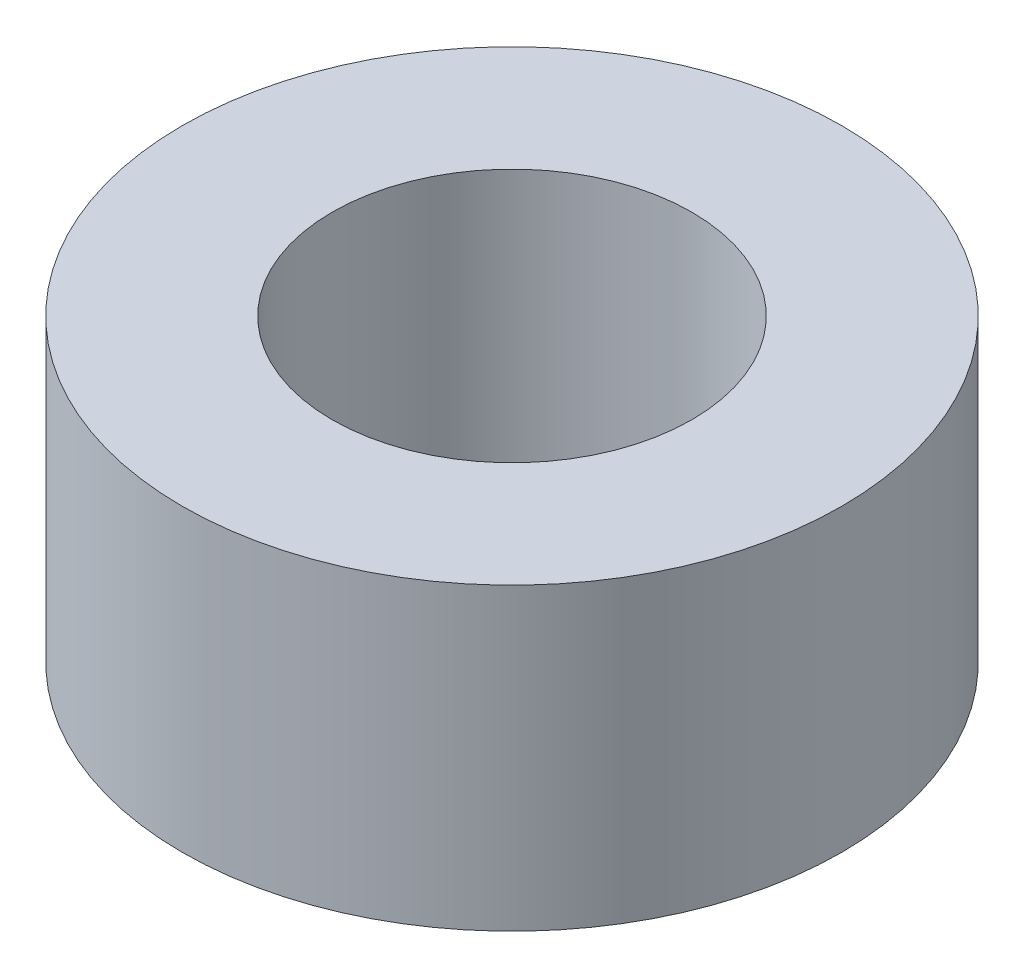
ISO-10303-21;
HEADER;
FILE_DESCRIPTION(('STEP AP214'),'2;1');
FILE_NAME('part.step','',(''),(''),'','','');
FILE_SCHEMA(('AUTOMOTIVE_DESIGN { 1 0 10303 214 1 1 1 1 }'));
ENDSEC;
DATA;
#1=APPLICATION_CONTEXT('core data for automotive mechanical design processes');
#2=APPLICATION_PROTOCOL_DEFINITION('international standard','automotive_design',2000,#1);
#3=PRODUCT_CONTEXT('',#1,'mechanical');
#4=PRODUCT('Part','Part','',(#3));
#5=PRODUCT_RELATED_PRODUCT_CATEGORY('part','',(#4));
#6=PRODUCT_DEFINITION_FORMATION('','',#4);
#7=PRODUCT_DEFINITION_CONTEXT('part definition',#1,'design');
#8=PRODUCT_DEFINITION('design','',#6,#7);
#9=PRODUCT_DEFINITION_SHAPE('','',#8);
#10=(LENGTH_UNIT() NAMED_UNIT(*) SI_UNIT(.MILLI.,.METRE.));
#11=(NAMED_UNIT(*) PLANE_ANGLE_UNIT() SI_UNIT($,.RADIAN.));
#12=(NAMED_UNIT(*) SI_UNIT($,.STERADIAN.) SOLID_ANGLE_UNIT());
#13=UNCERTAINTY_MEASURE_WITH_UNIT(LENGTH_MEASURE(1.E-05),#10,'distance_accuracy_value','');
#14=(GEOMETRIC_REPRESENTATION_CONTEXT(3) GLOBAL_UNCERTAINTY_ASSIGNED_CONTEXT((#13)) GLOBAL_UNIT_ASSIGNED_CONTEXT((#10,
#11,#12)) REPRESENTATION_CONTEXT('',''));
#15=CARTESIAN_POINT('',(0.,0.,0.));
#16=DIRECTION('',(0.,0.,1.));
#17=DIRECTION('',(1.,0.,0.));
#18=AXIS2_PLACEMENT_3D('',#15,#16,#17);
#19=CARTESIAN_POINT('',(0.,3.,0.));
#20=DIRECTION('',(0.,1.,0.));
#21=DIRECTION('',(0.,0.,1.));
#22=AXIS2_PLACEMENT_3D('',#19,#20,#21);
#23=PLANE('',#22);
#24=CARTESIAN_POINT('',(0.,3.,0.));
#25=DIRECTION('',(0.,1.,0.));
#26=DIRECTION('',(0.,0.,1.));
#27=AXIS2_PLACEMENT_3D('',#24,#25,#26);
#28=CIRCLE('',#27,3.3);
#29=CARTESIAN_POINT('',(0.,3.,3.3));
#30=VERTEX_POINT('',#29);
#31=EDGE_CURVE('E10',#30,#30,#28,.T.);
#32=ORIENTED_EDGE('',*,*,#31,.T.);
#33=EDGE_LOOP('',(#32));
#34=FACE_BOUND('',#33,.T.);
#35=CARTESIAN_POINT('',(0.,3.,0.));
#36=DIRECTION('',(0.,1.,0.));
#37=DIRECTION('',(0.,0.,1.));
#38=AXIS2_PLACEMENT_3D('',#35,#36,#37);
#39=CIRCLE('',#38,1.8);
#40=CARTESIAN_POINT('',(0.,3.,1.8));
#41=VERTEX_POINT('',#40);
#42=EDGE_CURVE('E42',#41,#41,#39,.T.);
#43=ORIENTED_EDGE('',*,*,#42,.F.);
#44=EDGE_LOOP('',(#43));
#45=FACE_BOUND('',#44,.T.);
#46=ADVANCED_FACE('F31',(#34,#45),#23,.T.);
#47=CARTESIAN_POINT('',(0.,0.,0.));
#48=DIRECTION('',(0.,1.,0.));
#49=DIRECTION('',(0.,0.,1.));
#50=AXIS2_PLACEMENT_3D('',#47,#48,#49);
#51=PLANE('',#50);
#52=CARTESIAN_POINT('',(0.,0.,0.));
#53=DIRECTION('',(0.,1.,0.));
#54=DIRECTION('',(0.,0.,1.));
#55=AXIS2_PLACEMENT_3D('',#52,#53,#54);
#56=CIRCLE('',#55,3.3);
#57=CARTESIAN_POINT('',(0.,0.,3.3));
#58=VERTEX_POINT('',#57);
#59=EDGE_CURVE('E35',#58,#58,#56,.T.);
#60=ORIENTED_EDGE('',*,*,#59,.F.);
#61=EDGE_LOOP('',(#60));
#62=FACE_BOUND('',#61,.T.);
#63=CARTESIAN_POINT('',(0.,0.,0.));
#64=DIRECTION('',(0.,1.,0.));
#65=DIRECTION('',(0.,0.,1.));
#66=AXIS2_PLACEMENT_3D('',#63,#64,#65);
#67=CIRCLE('',#66,1.8);
#68=CARTESIAN_POINT('',(0.,0.,1.8));
#69=VERTEX_POINT('',#68);
#70=EDGE_CURVE('E44',#69,#69,#67,.T.);
#71=ORIENTED_EDGE('',*,*,#70,.T.);
#72=EDGE_LOOP('',(#71));
#73=FACE_BOUND('',#72,.T.);
#74=ADVANCED_FACE('F54',(#62,#73),#51,.F.);
#75=CARTESIAN_POINT('',(0.,3.,0.));
#76=DIRECTION('',(0.,-1.,0.));
#77=DIRECTION('',(0.,0.,-1.));
#78=AXIS2_PLACEMENT_3D('',#75,#76,#77);
#79=CYLINDRICAL_SURFACE('',#78,3.3);
#80=ORIENTED_EDGE('',*,*,#31,.F.);
#81=EDGE_LOOP('',(#80));
#82=FACE_BOUND('',#81,.T.);
#83=ORIENTED_EDGE('',*,*,#59,.T.);
#84=EDGE_LOOP('',(#83));
#85=FACE_BOUND('',#84,.T.);
#86=ADVANCED_FACE('F33',(#82,#85),#79,.T.);
#87=CARTESIAN_POINT('',(0.,3.,0.));
#88=DIRECTION('',(0.,-1.,0.));
#89=DIRECTION('',(0.,0.,-1.));
#90=AXIS2_PLACEMENT_3D('',#87,#88,#89);
#91=CYLINDRICAL_SURFACE('',#90,1.8);
#92=ORIENTED_EDGE('',*,*,#42,.T.);
#93=EDGE_LOOP('',(#92));
#94=FACE_BOUND('',#93,.T.);
#95=ORIENTED_EDGE('',*,*,#70,.F.);
#96=EDGE_LOOP('',(#95));
#97=FACE_BOUND('',#96,.T.);
#98=ADVANCED_FACE('F50',(#94,#97),#91,.F.);
#99=CLOSED_SHELL('',(#46,#74,#86,#98));
#100=MANIFOLD_SOLID_BREP('B2',#99);
#101=ADVANCED_BREP_SHAPE_REPRESENTATION('',(#18,#100),#14);
#102=SHAPE_DEFINITION_REPRESENTATION(#9,#101);
ENDSEC;
END-ISO-10303-21;
